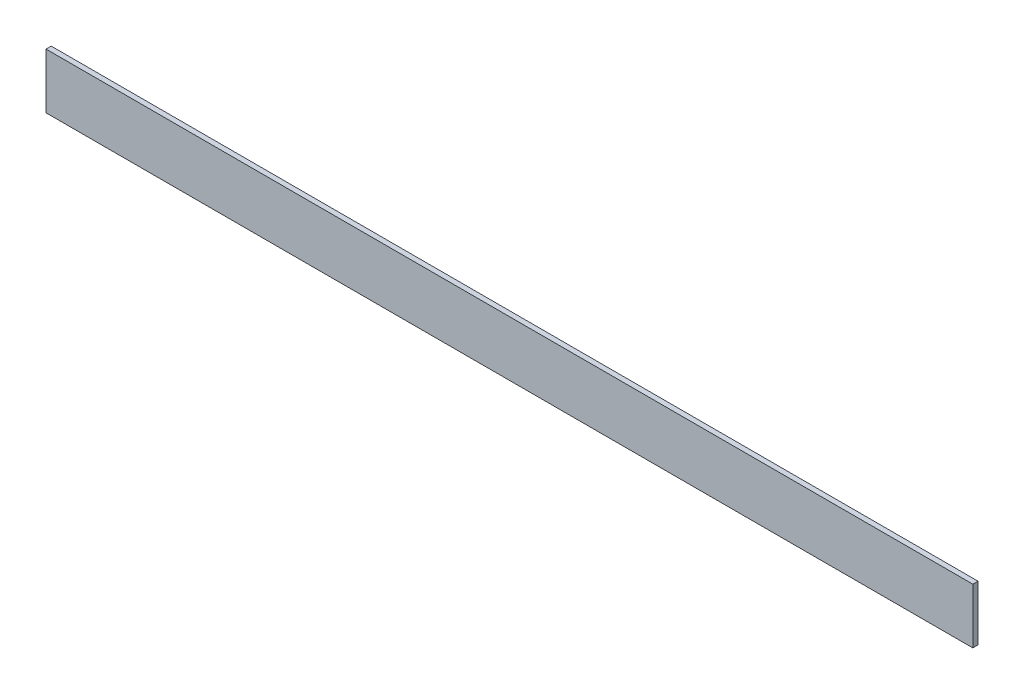
ISO-10303-21;
HEADER;
FILE_DESCRIPTION(('STEP AP214'),'2;1');
FILE_NAME('part.step','',(''),(''),'','','');
FILE_SCHEMA(('AUTOMOTIVE_DESIGN { 1 0 10303 214 1 1 1 1 }'));
ENDSEC;
DATA;
#1=APPLICATION_CONTEXT('core data for automotive mechanical design processes');
#2=APPLICATION_PROTOCOL_DEFINITION('international standard','automotive_design',2000,#1);
#3=PRODUCT_CONTEXT('',#1,'mechanical');
#4=PRODUCT('Part','Part','',(#3));
#5=PRODUCT_RELATED_PRODUCT_CATEGORY('part','',(#4));
#6=PRODUCT_DEFINITION_FORMATION('','',#4);
#7=PRODUCT_DEFINITION_CONTEXT('part definition',#1,'design');
#8=PRODUCT_DEFINITION('design','',#6,#7);
#9=PRODUCT_DEFINITION_SHAPE('','',#8);
#10=(LENGTH_UNIT() NAMED_UNIT(*) SI_UNIT(.MILLI.,.METRE.));
#11=(NAMED_UNIT(*) PLANE_ANGLE_UNIT() SI_UNIT($,.RADIAN.));
#12=(NAMED_UNIT(*) SI_UNIT($,.STERADIAN.) SOLID_ANGLE_UNIT());
#13=UNCERTAINTY_MEASURE_WITH_UNIT(LENGTH_MEASURE(1.E-05),#10,'distance_accuracy_value','');
#14=(GEOMETRIC_REPRESENTATION_CONTEXT(3) GLOBAL_UNCERTAINTY_ASSIGNED_CONTEXT((#13)) GLOBAL_UNIT_ASSIGNED_CONTEXT((#10,
#11,#12)) REPRESENTATION_CONTEXT('',''));
#15=CARTESIAN_POINT('',(0.,0.,0.));
#16=DIRECTION('',(0.,0.,1.));
#17=DIRECTION('',(1.,0.,0.));
#18=AXIS2_PLACEMENT_3D('',#15,#16,#17);
#19=CARTESIAN_POINT('',(-852.4875,-50.8000000000001,9.525));
#20=DIRECTION('',(1.,0.,0.));
#21=DIRECTION('',(0.,0.,-1.));
#22=AXIS2_PLACEMENT_3D('',#19,#20,#21);
#23=PLANE('',#22);
#24=DIRECTION('',(0.,-1.,0.));
#25=VECTOR('',#24,1.);
#26=CARTESIAN_POINT('',(-852.4875,-50.8000000000001,0.));
#27=LINE('',#26,#25);
#28=CARTESIAN_POINT('',(-852.4875,50.7999999999999,0.));
#29=VERTEX_POINT('',#28);
#30=CARTESIAN_POINT('',(-852.4875,-50.8000000000001,0.));
#31=VERTEX_POINT('',#30);
#32=EDGE_CURVE('E96',#29,#31,#27,.T.);
#33=ORIENTED_EDGE('',*,*,#32,.T.);
#34=DIRECTION('',(0.,0.,-1.));
#35=VECTOR('',#34,1.);
#36=CARTESIAN_POINT('',(-852.4875,-50.8000000000001,9.525));
#37=LINE('',#36,#35);
#38=CARTESIAN_POINT('',(-852.4875,-50.8000000000001,9.525));
#39=VERTEX_POINT('',#38);
#40=EDGE_CURVE('E11',#39,#31,#37,.T.);
#41=ORIENTED_EDGE('',*,*,#40,.F.);
#42=DIRECTION('',(0.,-1.,0.));
#43=VECTOR('',#42,1.);
#44=CARTESIAN_POINT('',(-852.4875,-50.8000000000001,9.525));
#45=LINE('',#44,#43);
#46=CARTESIAN_POINT('',(-852.4875,50.7999999999999,9.525));
#47=VERTEX_POINT('',#46);
#48=EDGE_CURVE('E84',#47,#39,#45,.T.);
#49=ORIENTED_EDGE('',*,*,#48,.F.);
#50=DIRECTION('',(0.,0.,-1.));
#51=VECTOR('',#50,1.);
#52=CARTESIAN_POINT('',(-852.4875,50.7999999999999,9.525));
#53=LINE('',#52,#51);
#54=EDGE_CURVE('E92',#47,#29,#53,.T.);
#55=ORIENTED_EDGE('',*,*,#54,.T.);
#56=EDGE_LOOP('',(#33,#41,#49,#55));
#57=FACE_BOUND('',#56,.T.);
#58=ADVANCED_FACE('F33',(#57),#23,.F.);
#59=CARTESIAN_POINT('',(852.4875,-50.7999999999999,9.525));
#60=DIRECTION('',(0.,1.,0.));
#61=DIRECTION('',(-1.,0.,0.));
#62=AXIS2_PLACEMENT_3D('',#59,#60,#61);
#63=PLANE('',#62);
#64=DIRECTION('',(1.,0.,0.));
#65=VECTOR('',#64,1.);
#66=CARTESIAN_POINT('',(852.4875,-50.7999999999999,0.));
#67=LINE('',#66,#65);
#68=CARTESIAN_POINT('',(852.4875,-50.7999999999999,0.));
#69=VERTEX_POINT('',#68);
#70=EDGE_CURVE('E88',#31,#69,#67,.T.);
#71=ORIENTED_EDGE('',*,*,#70,.T.);
#72=DIRECTION('',(0.,0.,-1.));
#73=VECTOR('',#72,1.);
#74=CARTESIAN_POINT('',(852.4875,-50.7999999999999,9.525));
#75=LINE('',#74,#73);
#76=CARTESIAN_POINT('',(852.4875,-50.7999999999999,9.525));
#77=VERTEX_POINT('',#76);
#78=EDGE_CURVE('E41',#77,#69,#75,.T.);
#79=ORIENTED_EDGE('',*,*,#78,.F.);
#80=DIRECTION('',(1.,0.,0.));
#81=VECTOR('',#80,1.);
#82=CARTESIAN_POINT('',(852.4875,-50.7999999999999,9.525));
#83=LINE('',#82,#81);
#84=EDGE_CURVE('E79',#39,#77,#83,.T.);
#85=ORIENTED_EDGE('',*,*,#84,.F.);
#86=ORIENTED_EDGE('',*,*,#40,.T.);
#87=EDGE_LOOP('',(#71,#79,#85,#86));
#88=FACE_BOUND('',#87,.T.);
#89=ADVANCED_FACE('F87',(#88),#63,.F.);
#90=CARTESIAN_POINT('',(852.4875,-50.7999999999999,9.525));
#91=DIRECTION('',(-1.,0.,0.));
#92=DIRECTION('',(0.,0.,1.));
#93=AXIS2_PLACEMENT_3D('',#90,#91,#92);
#94=PLANE('',#93);
#95=DIRECTION('',(0.,1.,0.));
#96=VECTOR('',#95,1.);
#97=CARTESIAN_POINT('',(852.4875,-50.7999999999999,0.));
#98=LINE('',#97,#96);
#99=CARTESIAN_POINT('',(852.4875,50.8000000000001,0.));
#100=VERTEX_POINT('',#99);
#101=EDGE_CURVE('E66',#69,#100,#98,.T.);
#102=ORIENTED_EDGE('',*,*,#101,.T.);
#103=DIRECTION('',(0.,0.,-1.));
#104=VECTOR('',#103,1.);
#105=CARTESIAN_POINT('',(852.4875,50.8000000000001,9.525));
#106=LINE('',#105,#104);
#107=CARTESIAN_POINT('',(852.4875,50.8000000000001,9.525));
#108=VERTEX_POINT('',#107);
#109=EDGE_CURVE('E89',#108,#100,#106,.T.);
#110=ORIENTED_EDGE('',*,*,#109,.F.);
#111=DIRECTION('',(0.,1.,0.));
#112=VECTOR('',#111,1.);
#113=CARTESIAN_POINT('',(852.4875,-50.7999999999999,9.525));
#114=LINE('',#113,#112);
#115=EDGE_CURVE('E82',#77,#108,#114,.T.);
#116=ORIENTED_EDGE('',*,*,#115,.F.);
#117=ORIENTED_EDGE('',*,*,#78,.T.);
#118=EDGE_LOOP('',(#102,#110,#116,#117));
#119=FACE_BOUND('',#118,.T.);
#120=ADVANCED_FACE('F90',(#119),#94,.F.);
#121=CARTESIAN_POINT('',(852.4875,50.8000000000001,9.525));
#122=DIRECTION('',(0.,-1.,0.));
#123=DIRECTION('',(1.,0.,0.));
#124=AXIS2_PLACEMENT_3D('',#121,#122,#123);
#125=PLANE('',#124);
#126=DIRECTION('',(-1.,0.,0.));
#127=VECTOR('',#126,1.);
#128=CARTESIAN_POINT('',(852.4875,50.8000000000001,0.));
#129=LINE('',#128,#127);
#130=EDGE_CURVE('E72',#100,#29,#129,.T.);
#131=ORIENTED_EDGE('',*,*,#130,.T.);
#132=ORIENTED_EDGE('',*,*,#54,.F.);
#133=DIRECTION('',(-1.,0.,0.));
#134=VECTOR('',#133,1.);
#135=CARTESIAN_POINT('',(852.4875,50.8000000000001,9.525));
#136=LINE('',#135,#134);
#137=EDGE_CURVE('E49',#108,#47,#136,.T.);
#138=ORIENTED_EDGE('',*,*,#137,.F.);
#139=ORIENTED_EDGE('',*,*,#109,.T.);
#140=EDGE_LOOP('',(#131,#132,#138,#139));
#141=FACE_BOUND('',#140,.T.);
#142=ADVANCED_FACE('F103',(#141),#125,.F.);
#143=CARTESIAN_POINT('',(0.,0.,9.525));
#144=DIRECTION('',(0.,0.,1.));
#145=DIRECTION('',(1.,0.,0.));
#146=AXIS2_PLACEMENT_3D('',#143,#144,#145);
#147=PLANE('',#146);
#148=ORIENTED_EDGE('',*,*,#48,.T.);
#149=ORIENTED_EDGE('',*,*,#84,.T.);
#150=ORIENTED_EDGE('',*,*,#115,.T.);
#151=ORIENTED_EDGE('',*,*,#137,.T.);
#152=EDGE_LOOP('',(#148,#149,#150,#151));
#153=FACE_BOUND('',#152,.T.);
#154=ADVANCED_FACE('F80',(#153),#147,.T.);
#155=CARTESIAN_POINT('',(0.,0.,0.));
#156=DIRECTION('',(0.,0.,1.));
#157=DIRECTION('',(1.,0.,0.));
#158=AXIS2_PLACEMENT_3D('',#155,#156,#157);
#159=PLANE('',#158);
#160=ORIENTED_EDGE('',*,*,#32,.F.);
#161=ORIENTED_EDGE('',*,*,#130,.F.);
#162=ORIENTED_EDGE('',*,*,#101,.F.);
#163=ORIENTED_EDGE('',*,*,#70,.F.);
#164=EDGE_LOOP('',(#160,#161,#162,#163));
#165=FACE_BOUND('',#164,.T.);
#166=ADVANCED_FACE('F106',(#165),#159,.F.);
#167=CLOSED_SHELL('',(#58,#89,#120,#142,#154,#166));
#168=MANIFOLD_SOLID_BREP('B2',#167);
#169=ADVANCED_BREP_SHAPE_REPRESENTATION('',(#18,#168),#14);
#170=SHAPE_DEFINITION_REPRESENTATION(#9,#169);
ENDSEC;
END-ISO-10303-21;
